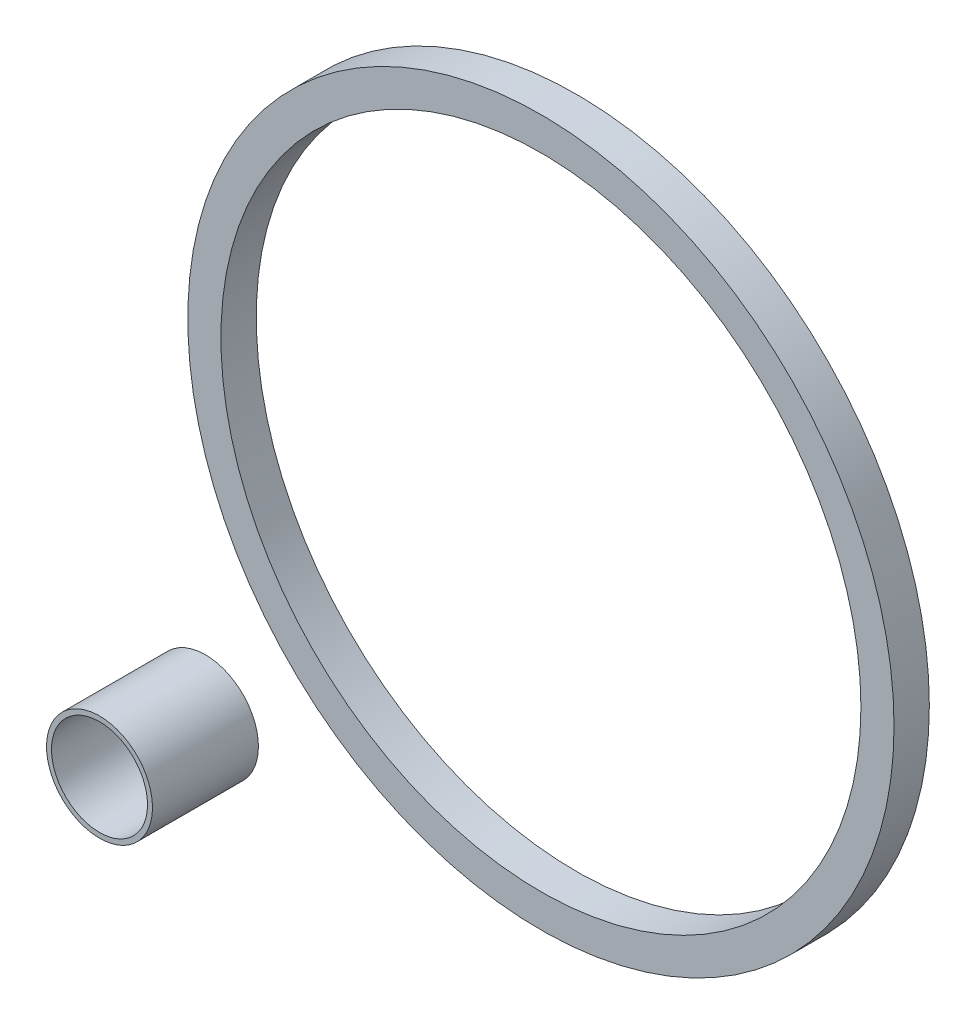
ISO-10303-21;
HEADER;
FILE_DESCRIPTION(('STEP AP214'),'2;1');
FILE_NAME('part.step','',(''),(''),'','','');
FILE_SCHEMA(('AUTOMOTIVE_DESIGN { 1 0 10303 214 1 1 1 1 }'));
ENDSEC;
DATA;
#1=APPLICATION_CONTEXT('core data for automotive mechanical design processes');
#2=APPLICATION_PROTOCOL_DEFINITION('international standard','automotive_design',2000,#1);
#3=PRODUCT_CONTEXT('',#1,'mechanical');
#4=PRODUCT('Part','Part','',(#3));
#5=PRODUCT_RELATED_PRODUCT_CATEGORY('part','',(#4));
#6=PRODUCT_DEFINITION_FORMATION('','',#4);
#7=PRODUCT_DEFINITION_CONTEXT('part definition',#1,'design');
#8=PRODUCT_DEFINITION('design','',#6,#7);
#9=PRODUCT_DEFINITION_SHAPE('','',#8);
#10=(LENGTH_UNIT() NAMED_UNIT(*) SI_UNIT(.MILLI.,.METRE.));
#11=(NAMED_UNIT(*) PLANE_ANGLE_UNIT() SI_UNIT($,.RADIAN.));
#12=(NAMED_UNIT(*) SI_UNIT($,.STERADIAN.) SOLID_ANGLE_UNIT());
#13=UNCERTAINTY_MEASURE_WITH_UNIT(LENGTH_MEASURE(1.E-05),#10,'distance_accuracy_value','');
#14=(GEOMETRIC_REPRESENTATION_CONTEXT(3) GLOBAL_UNCERTAINTY_ASSIGNED_CONTEXT((#13)) GLOBAL_UNIT_ASSIGNED_CONTEXT((#10,
#11,#12)) REPRESENTATION_CONTEXT('',''));
#15=CARTESIAN_POINT('',(0.,0.,0.));
#16=DIRECTION('',(0.,0.,1.));
#17=DIRECTION('',(1.,0.,0.));
#18=AXIS2_PLACEMENT_3D('',#15,#16,#17);
#19=CARTESIAN_POINT('',(0.,0.,1350.));
#20=DIRECTION('',(0.,0.,-1.));
#21=DIRECTION('',(-1.,0.,0.));
#22=AXIS2_PLACEMENT_3D('',#19,#20,#21);
#23=CYLINDRICAL_SURFACE('',#22,150.);
#24=CARTESIAN_POINT('',(0.,0.,1350.));
#25=DIRECTION('',(0.,0.,1.));
#26=DIRECTION('',(1.,0.,0.));
#27=AXIS2_PLACEMENT_3D('',#24,#25,#26);
#28=CIRCLE('',#27,150.);
#29=CARTESIAN_POINT('',(150.,0.,1350.));
#30=VERTEX_POINT('',#29);
#31=EDGE_CURVE('E11',#30,#30,#28,.T.);
#32=ORIENTED_EDGE('',*,*,#31,.F.);
#33=EDGE_LOOP('',(#32));
#34=FACE_BOUND('',#33,.T.);
#35=CARTESIAN_POINT('',(0.,0.,1050.));
#36=DIRECTION('',(0.,0.,1.));
#37=DIRECTION('',(1.,0.,0.));
#38=AXIS2_PLACEMENT_3D('',#35,#36,#37);
#39=CIRCLE('',#38,150.);
#40=CARTESIAN_POINT('',(150.,0.,1050.));
#41=VERTEX_POINT('',#40);
#42=EDGE_CURVE('E52',#41,#41,#39,.T.);
#43=ORIENTED_EDGE('',*,*,#42,.T.);
#44=EDGE_LOOP('',(#43));
#45=FACE_BOUND('',#44,.T.);
#46=ADVANCED_FACE('F45',(#34,#45),#23,.T.);
#47=CARTESIAN_POINT('',(0.,0.,1350.));
#48=DIRECTION('',(0.,0.,1.));
#49=DIRECTION('',(1.,0.,0.));
#50=AXIS2_PLACEMENT_3D('',#47,#48,#49);
#51=PLANE('',#50);
#52=CARTESIAN_POINT('',(0.,0.,1350.));
#53=DIRECTION('',(0.,0.,1.));
#54=DIRECTION('',(1.,0.,0.));
#55=AXIS2_PLACEMENT_3D('',#52,#53,#54);
#56=CIRCLE('',#55,135.931652244637);
#57=CARTESIAN_POINT('',(135.931652244637,0.,1350.));
#58=VERTEX_POINT('',#57);
#59=EDGE_CURVE('E57',#58,#58,#56,.F.);
#60=ORIENTED_EDGE('',*,*,#59,.T.);
#61=EDGE_LOOP('',(#60));
#62=FACE_BOUND('',#61,.T.);
#63=ORIENTED_EDGE('',*,*,#31,.T.);
#64=EDGE_LOOP('',(#63));
#65=FACE_BOUND('',#64,.T.);
#66=ADVANCED_FACE('F70',(#62,#65),#51,.T.);
#67=CARTESIAN_POINT('',(0.,0.,1050.));
#68=DIRECTION('',(0.,0.,1.));
#69=DIRECTION('',(1.,0.,0.));
#70=AXIS2_PLACEMENT_3D('',#67,#68,#69);
#71=PLANE('',#70);
#72=CARTESIAN_POINT('',(0.,0.,1050.));
#73=DIRECTION('',(0.,0.,1.));
#74=DIRECTION('',(1.,0.,0.));
#75=AXIS2_PLACEMENT_3D('',#72,#73,#74);
#76=CIRCLE('',#75,135.931652244637);
#77=CARTESIAN_POINT('',(135.931652244637,0.,1050.));
#78=VERTEX_POINT('',#77);
#79=EDGE_CURVE('E48',#78,#78,#76,.F.);
#80=ORIENTED_EDGE('',*,*,#79,.F.);
#81=EDGE_LOOP('',(#80));
#82=FACE_BOUND('',#81,.T.);
#83=ORIENTED_EDGE('',*,*,#42,.F.);
#84=EDGE_LOOP('',(#83));
#85=FACE_BOUND('',#84,.T.);
#86=ADVANCED_FACE('F67',(#82,#85),#71,.F.);
#87=CARTESIAN_POINT('',(0.,0.,1920.));
#88=DIRECTION('',(0.,0.,-1.));
#89=DIRECTION('',(-1.,0.,0.));
#90=AXIS2_PLACEMENT_3D('',#87,#88,#89);
#91=CYLINDRICAL_SURFACE('',#90,135.931652244637);
#92=ORIENTED_EDGE('',*,*,#59,.F.);
#93=EDGE_LOOP('',(#92));
#94=FACE_BOUND('',#93,.T.);
#95=ORIENTED_EDGE('',*,*,#79,.T.);
#96=EDGE_LOOP('',(#95));
#97=FACE_BOUND('',#96,.T.);
#98=ADVANCED_FACE('F65',(#94,#97),#91,.F.);
#99=CLOSED_SHELL('',(#46,#66,#86,#98));
#100=MANIFOLD_SOLID_BREP('B2',#99);
#101=CARTESIAN_POINT('',(0.,0.,100.));
#102=DIRECTION('',(0.,0.,-1.));
#103=DIRECTION('',(-1.,0.,0.));
#104=AXIS2_PLACEMENT_3D('',#101,#102,#103);
#105=CYLINDRICAL_SURFACE('',#104,1000.);
#106=CARTESIAN_POINT('',(0.,0.,100.));
#107=DIRECTION('',(0.,0.,1.));
#108=DIRECTION('',(1.,0.,0.));
#109=AXIS2_PLACEMENT_3D('',#106,#107,#108);
#110=CIRCLE('',#109,1000.);
#111=CARTESIAN_POINT('',(1000.,0.,100.));
#112=VERTEX_POINT('',#111);
#113=EDGE_CURVE('E44',#112,#112,#110,.T.);
#114=ORIENTED_EDGE('',*,*,#113,.F.);
#115=EDGE_LOOP('',(#114));
#116=FACE_BOUND('',#115,.T.);
#117=CARTESIAN_POINT('',(0.,0.,0.));
#118=DIRECTION('',(0.,0.,1.));
#119=DIRECTION('',(1.,0.,0.));
#120=AXIS2_PLACEMENT_3D('',#117,#118,#119);
#121=CIRCLE('',#120,1000.);
#122=CARTESIAN_POINT('',(1000.,0.,0.));
#123=VERTEX_POINT('',#122);
#124=EDGE_CURVE('E110',#123,#123,#121,.T.);
#125=ORIENTED_EDGE('',*,*,#124,.T.);
#126=EDGE_LOOP('',(#125));
#127=FACE_BOUND('',#126,.T.);
#128=ADVANCED_FACE('F107',(#116,#127),#105,.T.);
#129=CARTESIAN_POINT('',(0.,0.,100.));
#130=DIRECTION('',(0.,0.,1.));
#131=DIRECTION('',(1.,0.,0.));
#132=AXIS2_PLACEMENT_3D('',#129,#130,#131);
#133=PLANE('',#132);
#134=CARTESIAN_POINT('',(0.,0.,99.9999999999996));
#135=DIRECTION('',(0.,0.,1.));
#136=DIRECTION('',(1.,0.,0.));
#137=AXIS2_PLACEMENT_3D('',#134,#135,#136);
#138=CIRCLE('',#137,906.211014964245);
#139=CARTESIAN_POINT('',(906.211014964245,0.,99.9999999999996));
#140=VERTEX_POINT('',#139);
#141=EDGE_CURVE('E119',#140,#140,#138,.F.);
#142=ORIENTED_EDGE('',*,*,#141,.T.);
#143=EDGE_LOOP('',(#142));
#144=FACE_BOUND('',#143,.T.);
#145=ORIENTED_EDGE('',*,*,#113,.T.);
#146=EDGE_LOOP('',(#145));
#147=FACE_BOUND('',#146,.T.);
#148=ADVANCED_FACE('F139',(#144,#147),#133,.T.);
#149=CARTESIAN_POINT('',(0.,0.,0.));
#150=DIRECTION('',(0.,0.,1.));
#151=DIRECTION('',(1.,0.,0.));
#152=AXIS2_PLACEMENT_3D('',#149,#150,#151);
#153=PLANE('',#152);
#154=CARTESIAN_POINT('',(0.,0.,0.));
#155=DIRECTION('',(0.,0.,1.));
#156=DIRECTION('',(1.,0.,0.));
#157=AXIS2_PLACEMENT_3D('',#154,#155,#156);
#158=CIRCLE('',#157,906.211014964245);
#159=CARTESIAN_POINT('',(906.211014964245,0.,0.));
#160=VERTEX_POINT('',#159);
#161=EDGE_CURVE('E124',#160,#160,#158,.T.);
#162=ORIENTED_EDGE('',*,*,#161,.T.);
#163=EDGE_LOOP('',(#162));
#164=FACE_BOUND('',#163,.T.);
#165=ORIENTED_EDGE('',*,*,#124,.F.);
#166=EDGE_LOOP('',(#165));
#167=FACE_BOUND('',#166,.T.);
#168=ADVANCED_FACE('F129',(#164,#167),#153,.F.);
#169=CARTESIAN_POINT('',(0.,0.,6000.));
#170=DIRECTION('',(0.,0.,-1.));
#171=DIRECTION('',(-1.,0.,0.));
#172=AXIS2_PLACEMENT_3D('',#169,#170,#171);
#173=CYLINDRICAL_SURFACE('',#172,906.211014964245);
#174=ORIENTED_EDGE('',*,*,#141,.F.);
#175=EDGE_LOOP('',(#174));
#176=FACE_BOUND('',#175,.T.);
#177=ORIENTED_EDGE('',*,*,#161,.F.);
#178=EDGE_LOOP('',(#177));
#179=FACE_BOUND('',#178,.T.);
#180=ADVANCED_FACE('F132',(#176,#179),#173,.F.);
#181=CLOSED_SHELL('',(#128,#148,#168,#180));
#182=MANIFOLD_SOLID_BREP('B6',#181);
#183=ADVANCED_BREP_SHAPE_REPRESENTATION('',(#18,#100,#182),#14);
#184=SHAPE_DEFINITION_REPRESENTATION(#9,#183);
ENDSEC;
END-ISO-10303-21;
